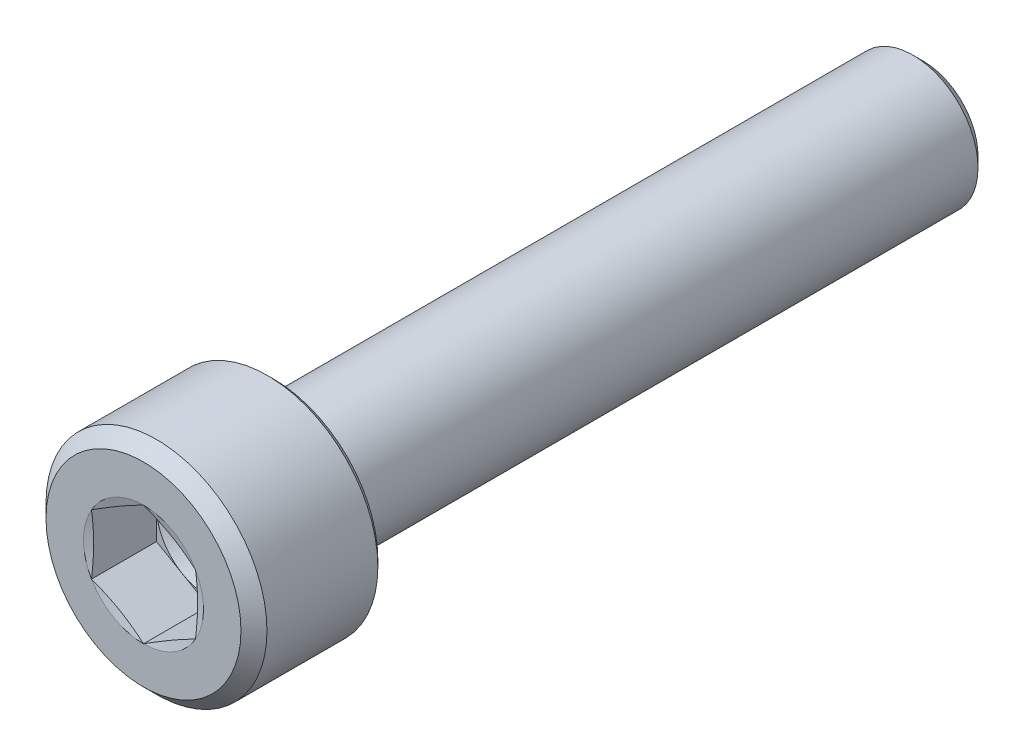
ISO-10303-21;
HEADER;
FILE_DESCRIPTION(('STEP AP214'),'2;1');
FILE_NAME('part.step','',(''),(''),'','','');
FILE_SCHEMA(('AUTOMOTIVE_DESIGN { 1 0 10303 214 1 1 1 1 }'));
ENDSEC;
DATA;
#1=APPLICATION_CONTEXT('core data for automotive mechanical design processes');
#2=APPLICATION_PROTOCOL_DEFINITION('international standard','automotive_design',2000,#1);
#3=PRODUCT_CONTEXT('',#1,'mechanical');
#4=PRODUCT('Part','Part','',(#3));
#5=PRODUCT_RELATED_PRODUCT_CATEGORY('part','',(#4));
#6=PRODUCT_DEFINITION_FORMATION('','',#4);
#7=PRODUCT_DEFINITION_CONTEXT('part definition',#1,'design');
#8=PRODUCT_DEFINITION('design','',#6,#7);
#9=PRODUCT_DEFINITION_SHAPE('','',#8);
#10=(LENGTH_UNIT() NAMED_UNIT(*) SI_UNIT(.MILLI.,.METRE.));
#11=(NAMED_UNIT(*) PLANE_ANGLE_UNIT() SI_UNIT($,.RADIAN.));
#12=(NAMED_UNIT(*) SI_UNIT($,.STERADIAN.) SOLID_ANGLE_UNIT());
#13=UNCERTAINTY_MEASURE_WITH_UNIT(LENGTH_MEASURE(1.E-05),#10,'distance_accuracy_value','');
#14=(GEOMETRIC_REPRESENTATION_CONTEXT(3) GLOBAL_UNCERTAINTY_ASSIGNED_CONTEXT((#13)) GLOBAL_UNIT_ASSIGNED_CONTEXT((#10,
#11,#12)) REPRESENTATION_CONTEXT('',''));
#15=CARTESIAN_POINT('',(0.,0.,0.));
#16=DIRECTION('',(0.,0.,1.));
#17=DIRECTION('',(1.,0.,0.));
#18=AXIS2_PLACEMENT_3D('',#15,#16,#17);
#19=CARTESIAN_POINT('',(2.,1.15470053837925,-2.5));
#20=DIRECTION('',(0.5,0.866025403784439,0.));
#21=DIRECTION('',(0.,0.,-1.));
#22=AXIS2_PLACEMENT_3D('',#19,#20,#21);
#23=PLANE('',#22);
#24=CARTESIAN_POINT('',(0.,2.3094010767585,0.));
#25=CARTESIAN_POINT('',(0.0425633823119709,2.28482382570566,-0.00658527078297476));
#26=CARTESIAN_POINT('',(0.0851609621981744,2.26022123386399,-0.0128624617924369));
#27=CARTESIAN_POINT('',(0.169590719267182,2.21146278990734,-0.0246149197548439));
#28=CARTESIAN_POINT('',(0.211421466351945,2.18730767178011,-0.0301035344043213));
#29=CARTESIAN_POINT('',(0.294534709698704,2.13933338683679,-0.040280933909989));
#30=CARTESIAN_POINT('',(0.335816093292774,2.11551457414403,-0.0449804129267517));
#31=CARTESIAN_POINT('',(0.418067328723173,2.06807245954831,-0.0535800869691));
#32=CARTESIAN_POINT('',(0.459036573992681,2.04444936338046,-0.0574872034397301));
#33=CARTESIAN_POINT('',(0.542105942407446,1.9964713268923,-0.0646202919637414));
#34=CARTESIAN_POINT('',(0.584206512798949,1.97211395870297,-0.0678248446642616));
#35=CARTESIAN_POINT('',(0.667845331882696,1.92372969130639,-0.0733062525415356));
#36=CARTESIAN_POINT('',(0.709382918692335,1.89970310083371,-0.0755958396504206));
#37=CARTESIAN_POINT('',(0.792314561065246,1.85180334473725,-0.0792518110133403));
#38=CARTESIAN_POINT('',(0.833708317497489,1.82793000580705,-0.0806226814230358));
#39=CARTESIAN_POINT('',(0.916742308626357,1.78006798987556,-0.0824510114905856));
#40=CARTESIAN_POINT('',(0.958382685265035,1.75607937336024,-0.0829035836538504));
#41=CARTESIAN_POINT('',(1.04160656499749,1.70802844834745,-0.0829039536078804));
#42=CARTESIAN_POINT('',(1.08319008000349,1.68396616048509,-0.0824519850713464));
#43=CARTESIAN_POINT('',(1.16614232267812,1.6359959725784,-0.0806244508305484));
#44=CARTESIAN_POINT('',(1.20751106141079,1.6120879122194,-0.0792536194503931));
#45=CARTESIAN_POINT('',(1.29046039872099,1.56421931101609,-0.075597576905792));
#46=CARTESIAN_POINT('',(1.33204099774182,1.54025912804585,-0.0733077208074989));
#47=CARTESIAN_POINT('',(1.4157769716645,1.49200969870299,-0.0678257908964699));
#48=CARTESIAN_POINT('',(1.45793172268238,1.46772084361545,-0.0646208369566601));
#49=CARTESIAN_POINT('',(1.54102078903926,1.4197637523774,-0.0574880406163537));
#50=CARTESIAN_POINT('',(1.58195747255381,1.39609636968376,-0.053581927053499));
#51=CARTESIAN_POINT('',(1.6641612654645,1.34858874355377,-0.0449835352058574));
#52=CARTESIAN_POINT('',(1.70542789927246,1.32474894442612,-0.0402842703166062));
#53=CARTESIAN_POINT('',(1.78853179531606,1.27675920888577,-0.0301068254493336));
#54=CARTESIAN_POINT('',(1.83036819240582,1.25261006903423,-0.0246178875385511));
#55=CARTESIAN_POINT('',(1.91481706725898,1.20386805540337,-0.0128642509205647));
#56=CARTESIAN_POINT('',(1.95742818508913,1.1792760521365,-0.00658614229819594));
#57=CARTESIAN_POINT('',(2.,1.15470053837925,0.));
#58=B_SPLINE_CURVE_WITH_KNOTS('',3,(#24,#25,#26,#27,#28,#29,#30,#31,#32,#33,#34,#35,#36,#37,#38,
#39,#40,#41,#42,#43,#44,#45,#46,#47,#48,#49,#50,#51,#52,#53,#54,#55,#56,#57),.UNSPECIFIED.,.F.,
.F.,(4,2,2,2,2,2,2,2,2,2,2,2,2,2,2,2,4),(0.,0.148766874535286,0.294606820686169,
0.438274846282944,0.580628017656161,0.726853447545081,0.87096665161791,1.01437091148585,
1.15853643630558,1.30266472322194,1.44605605797195,1.59018143609231,1.73644485761236,
1.87877967487471,2.02244082191178,2.16828655385211,2.31707290991441),.UNSPECIFIED.);
#59=CARTESIAN_POINT('',(0.,2.30940107675851,0.));
#60=VERTEX_POINT('',#59);
#61=CARTESIAN_POINT('',(2.,1.15470053837925,0.));
#62=VERTEX_POINT('',#61);
#63=EDGE_CURVE('E157',#60,#62,#58,.T.);
#64=ORIENTED_EDGE('',*,*,#63,.F.);
#65=DIRECTION('',(0.,0.,1.));
#66=VECTOR('',#65,1.);
#67=CARTESIAN_POINT('',(0.,2.30940107675851,-2.5));
#68=LINE('',#67,#66);
#69=CARTESIAN_POINT('',(0.,2.30940107675851,-2.5));
#70=VERTEX_POINT('',#69);
#71=EDGE_CURVE('E332',#70,#60,#68,.T.);
#72=ORIENTED_EDGE('',*,*,#71,.F.);
#73=DIRECTION('',(-0.866025403784439,0.5,0.));
#74=VECTOR('',#73,1.);
#75=CARTESIAN_POINT('',(2.,1.15470053837925,-2.5));
#76=LINE('',#75,#74);
#77=CARTESIAN_POINT('',(1.,1.73205080756888,-2.5));
#78=VERTEX_POINT('',#77);
#79=EDGE_CURVE('E380',#78,#70,#76,.T.);
#80=ORIENTED_EDGE('',*,*,#79,.F.);
#81=DIRECTION('',(-0.866025403784439,0.5,0.));
#82=VECTOR('',#81,1.);
#83=CARTESIAN_POINT('',(2.,1.15470053837925,-2.5));
#84=LINE('',#83,#82);
#85=CARTESIAN_POINT('',(2.,1.15470053837925,-2.5));
#86=VERTEX_POINT('',#85);
#87=EDGE_CURVE('E161',#86,#78,#84,.T.);
#88=ORIENTED_EDGE('',*,*,#87,.F.);
#89=DIRECTION('',(0.,0.,1.));
#90=VECTOR('',#89,1.);
#91=CARTESIAN_POINT('',(2.,1.15470053837925,-2.5));
#92=LINE('',#91,#90);
#93=EDGE_CURVE('E10',#86,#62,#92,.T.);
#94=ORIENTED_EDGE('',*,*,#93,.T.);
#95=EDGE_LOOP('',(#64,#72,#80,#88,#94));
#96=FACE_BOUND('',#95,.T.);
#97=ADVANCED_FACE('F16',(#96),#23,.F.);
#98=CARTESIAN_POINT('',(2.,-1.15470053837925,-2.5));
#99=DIRECTION('',(1.,0.,0.));
#100=DIRECTION('',(0.,1.,0.));
#101=AXIS2_PLACEMENT_3D('',#98,#99,#100);
#102=PLANE('',#101);
#103=CARTESIAN_POINT('',(2.,1.15470053837925,0.));
#104=CARTESIAN_POINT('',(1.9999971758146,1.10559938016855,-0.00657877825937162));
#105=CARTESIAN_POINT('',(1.99998944699676,1.05645602304888,-0.0128501009115137));
#106=CARTESIAN_POINT('',(1.99997806658765,0.959054194252896,-0.0245924298625357));
#107=CARTESIAN_POINT('',(1.99997433781248,0.910797323995098,-0.0300767483155109));
#108=CARTESIAN_POINT('',(1.99998359751542,0.81492579320712,-0.0402471560748688));
#109=CARTESIAN_POINT('',(1.9999963378607,0.767312271204178,-0.0449439165892805));
#110=CARTESIAN_POINT('',(2.00003546653749,0.672453111011467,-0.0535397458043652));
#111=CARTESIAN_POINT('',(2.00006172870545,0.625208100919636,-0.0574457313280469));
#112=CARTESIAN_POINT('',(2.00004611837403,0.529274763219141,-0.0645855968989982));
#113=CARTESIAN_POINT('',(2.00000222670508,0.480584711064261,-0.0677964274113592));
#114=CARTESIAN_POINT('',(1.99991841748751,0.383860331701837,-0.0732888727540297));
#115=CARTESIAN_POINT('',(1.99987845152948,0.335826737171599,-0.0755832901194108));
#116=CARTESIAN_POINT('',(1.99986366588704,0.239962717981797,-0.0792453120947795));
#117=CARTESIAN_POINT('',(1.9998885239626,0.192132467715618,-0.0806174586142727));
#118=CARTESIAN_POINT('',(1.99994941208485,0.0962015340396727,-0.08245246044446));
#119=CARTESIAN_POINT('',(1.99998550051117,0.0481007579972217,-0.0829104692770044));
#120=CARTESIAN_POINT('',(2.,0.,-0.0829037686547589));
#121=B_SPLINE_CURVE_WITH_KNOTS('',3,(#103,#104,#105,#106,#107,#108,#109,#110,#111,#112,#113,
#114,#115,#116,#117,#118,#119,#120),.UNSPECIFIED.,.F.,.F.,(4,2,2,2,2,2,2,2,4),(0.,
0.148620259481538,0.294318135051254,0.437846221402298,0.580058773528502,0.726438720844375,
0.870695461275644,1.01423647053232,1.15853648999317),.UNSPECIFIED.);
#122=CARTESIAN_POINT('',(2.,0.,-0.082903768654759));
#123=VERTEX_POINT('',#122);
#124=EDGE_CURVE('E196',#62,#123,#121,.T.);
#125=ORIENTED_EDGE('',*,*,#124,.F.);
#126=ORIENTED_EDGE('',*,*,#93,.F.);
#127=DIRECTION('',(0.,1.,0.));
#128=VECTOR('',#127,1.);
#129=CARTESIAN_POINT('',(2.,-1.15470053837925,-2.5));
#130=LINE('',#129,#128);
#131=CARTESIAN_POINT('',(2.,0.,-2.5));
#132=VERTEX_POINT('',#131);
#133=EDGE_CURVE('E174',#132,#86,#130,.T.);
#134=ORIENTED_EDGE('',*,*,#133,.F.);
#135=DIRECTION('',(0.,1.,0.));
#136=VECTOR('',#135,1.);
#137=CARTESIAN_POINT('',(2.,-1.15470053837925,-2.5));
#138=LINE('',#137,#136);
#139=CARTESIAN_POINT('',(2.,-1.15470053837925,-2.5));
#140=VERTEX_POINT('',#139);
#141=EDGE_CURVE('E361',#140,#132,#138,.T.);
#142=ORIENTED_EDGE('',*,*,#141,.F.);
#143=DIRECTION('',(0.,0.,1.));
#144=VECTOR('',#143,1.);
#145=CARTESIAN_POINT('',(2.,-1.15470053837925,-2.5));
#146=LINE('',#145,#144);
#147=CARTESIAN_POINT('',(2.,-1.15470053837925,0.));
#148=VERTEX_POINT('',#147);
#149=EDGE_CURVE('E29',#140,#148,#146,.T.);
#150=ORIENTED_EDGE('',*,*,#149,.T.);
#151=CARTESIAN_POINT('',(2.,0.,-0.0829037686547589));
#152=CARTESIAN_POINT('',(1.99998555981411,-0.0480626337482096,-0.0829104454697722));
#153=CARTESIAN_POINT('',(1.99995090495526,-0.0961252790550645,-0.0824527966371758));
#154=CARTESIAN_POINT('',(1.99989390848693,-0.191988216165346,-0.0806195306727037));
#155=CARTESIAN_POINT('',(1.9998715050684,-0.23978859752026,-0.0792486003594746));
#156=CARTESIAN_POINT('',(1.99989058893969,-0.335600482143639,-0.0755899847635507));
#157=CARTESIAN_POINT('',(1.99993240569122,-0.383611805647936,-0.0732976169410381));
#158=CARTESIAN_POINT('',(2.00001693407639,-0.480298664501986,-0.0678104164072034));
#159=CARTESIAN_POINT('',(2.00005964977091,-0.528973461379009,-0.0646026718115913));
#160=CARTESIAN_POINT('',(2.00007157520278,-0.624916052866736,-0.0574667105464565));
#161=CARTESIAN_POINT('',(2.00004278566152,-0.67218552115141,-0.0535608791712345));
#162=CARTESIAN_POINT('',(2.00000007634783,-0.767094417138231,-0.0449640408208166));
#163=CARTESIAN_POINT('',(1.99998629681263,-0.814733214974058,-0.040266094585913));
#164=CARTESIAN_POINT('',(1.99997547969609,-0.910656840517129,-0.0300922148547882));
#165=CARTESIAN_POINT('',(1.99997869881092,-0.958940526378031,-0.0246055771048901));
#166=CARTESIAN_POINT('',(1.99998947348254,-1.05639814339213,-0.0128574794542081));
#167=CARTESIAN_POINT('',(1.99999711487367,-1.10557046827418,-0.00658266592061943));
#168=CARTESIAN_POINT('',(2.,-1.15470053837925,0.));
#169=B_SPLINE_CURVE_WITH_KNOTS('',3,(#151,#152,#153,#154,#155,#156,#157,#158,#159,#160,#161,
#162,#163,#164,#165,#166,#167,#168),.UNSPECIFIED.,.F.,.F.,(4,2,2,2,2,2,2,2,4),(0.,
0.144185638963415,0.287636981833131,0.431826719642445,0.578160405495087,0.720446033944631,
0.864049915829581,1.00982849989602,1.15853627726478),.UNSPECIFIED.);
#170=EDGE_CURVE('E198',#123,#148,#169,.T.);
#171=ORIENTED_EDGE('',*,*,#170,.F.);
#172=EDGE_LOOP('',(#125,#126,#134,#142,#150,#171));
#173=FACE_BOUND('',#172,.T.);
#174=ADVANCED_FACE('F203',(#173),#102,.F.);
#175=CARTESIAN_POINT('',(0.,-2.3094010767585,-2.5));
#176=DIRECTION('',(0.5,-0.866025403784439,0.));
#177=DIRECTION('',(0.,0.,-1.));
#178=AXIS2_PLACEMENT_3D('',#175,#176,#177);
#179=PLANE('',#178);
#180=CARTESIAN_POINT('',(2.,-1.15470053837925,0.));
#181=CARTESIAN_POINT('',(1.95743378507766,-1.17927288320565,-0.0065852707828837));
#182=CARTESIAN_POINT('',(1.91482852560134,-1.20386217360572,-0.0128624617922492));
#183=CARTESIAN_POINT('',(1.83038759595222,-1.2526012660842,-0.0246149197545318));
#184=CARTESIAN_POINT('',(1.78855327648046,-1.27675019665525,-0.030103534403975));
#185=CARTESIAN_POINT('',(1.7054497053178,-1.32474123431294,-0.0402809339096389));
#186=CARTESIAN_POINT('',(1.66418131664067,-1.34858255486255,-0.0449804129264252));
#187=CARTESIAN_POINT('',(1.58196962247549,-1.39609315694039,-0.0535800869689056));
#188=CARTESIAN_POINT('',(1.5410267984427,-1.4197620160339,-0.0574872034396377));
#189=CARTESIAN_POINT('',(1.45794191581271,-1.46771318111302,-0.0646202919637392));
#190=CARTESIAN_POINT('',(1.41579753099615,-1.49199466049072,-0.0678248446642694));
#191=CARTESIAN_POINT('',(1.33207611674604,-1.54023586886093,-0.0733062525415533));
#192=CARTESIAN_POINT('',(1.29049968562577,-1.56419517901357,-0.075595839650431));
#193=CARTESIAN_POINT('',(1.20755145882476,-1.61206621003797,-0.079251811013348));
#194=CARTESIAN_POINT('',(1.16617966262179,-1.63597758520144,-0.0806226814230399));
#195=CARTESIAN_POINT('',(1.08321294538366,-1.68395612293148,-0.0824510114905914));
#196=CARTESIAN_POINT('',(1.04161800575987,-1.70802343866645,-0.0829035836538532));
#197=CARTESIAN_POINT('',(0.958392744156322,-1.7560719702104,-0.0829039536078792));
#198=CARTESIAN_POINT('',(0.916762434090979,-1.78005320665323,-0.0824519850713494));
#199=CARTESIAN_POINT('',(0.833742911401647,-1.82790686215718,-0.080624450830552));
#200=CARTESIAN_POINT('',(0.792353554409066,-1.85177921064272,-0.0792536194503983));
#201=CARTESIAN_POINT('',(0.709423461068239,-1.89968114337871,-0.0755975769057984));
#202=CARTESIAN_POINT('',(0.667883034426375,-1.92371090695011,-0.0733077208075098));
#203=CARTESIAN_POINT('',(0.584229815936511,-1.97210367290616,-0.067825790896475));
#204=CARTESIAN_POINT('',(0.542117674893325,-1.99646633063398,-0.0646208369566592));
#205=CARTESIAN_POINT('',(0.459041082411246,-2.04444502725692,-0.0574880406162984));
#206=CARTESIAN_POINT('',(0.418076185999905,-2.06806354378067,-0.0535819270533825));
#207=CARTESIAN_POINT('',(0.335831478442079,-2.1155003036641,-0.0449835352056614));
#208=CARTESIAN_POINT('',(0.294552289872298,-2.13931835730668,-0.0402842703163962));
#209=CARTESIAN_POINT('',(0.211440011751603,-2.18729357466367,-0.0301068254491258));
#210=CARTESIAN_POINT('',(0.169608044615814,-2.21145038742034,-0.0246178875383639));
#211=CARTESIAN_POINT('',(0.0851717851537173,-2.26021425154841,-0.012864250920452));
#212=CARTESIAN_POINT('',(0.0425689266799132,-2.2848205604393,-0.00658614229814123));
#213=CARTESIAN_POINT('',(0.,-2.3094010767585,0.));
#214=B_SPLINE_CURVE_WITH_KNOTS('',3,(#180,#181,#182,#183,#184,#185,#186,#187,#188,#189,#190,
#191,#192,#193,#194,#195,#196,#197,#198,#199,#200,#201,#202,#203,#204,#205,#206,#207,#208,#209,
#210,#211,#212,#213),.UNSPECIFIED.,.F.,.F.,(4,2,2,2,2,2,2,2,2,2,2,2,2,2,2,2,4),(0.,
0.148766874533244,0.294606820683524,0.438274846281021,0.58062801765617,0.726853447543114,
0.870966651615286,1.01437091148389,1.15853643630559,1.30266472322314,1.44605605797354,
1.5901814360935,1.73644485761236,1.87877967487588,2.02244082191339,2.16828655385335,
2.31707290991442),.UNSPECIFIED.);
#215=CARTESIAN_POINT('',(0.,-2.30940107675851,0.));
#216=VERTEX_POINT('',#215);
#217=EDGE_CURVE('E175',#148,#216,#214,.T.);
#218=ORIENTED_EDGE('',*,*,#217,.F.);
#219=ORIENTED_EDGE('',*,*,#149,.F.);
#220=DIRECTION('',(0.866025403784439,0.5,0.));
#221=VECTOR('',#220,1.);
#222=CARTESIAN_POINT('',(0.,-2.3094010767585,-2.5));
#223=LINE('',#222,#221);
#224=CARTESIAN_POINT('',(1.,-1.73205080756887,-2.5));
#225=VERTEX_POINT('',#224);
#226=EDGE_CURVE('E365',#225,#140,#223,.T.);
#227=ORIENTED_EDGE('',*,*,#226,.F.);
#228=DIRECTION('',(0.866025403784439,0.5,0.));
#229=VECTOR('',#228,1.);
#230=CARTESIAN_POINT('',(0.,-2.3094010767585,-2.5));
#231=LINE('',#230,#229);
#232=CARTESIAN_POINT('',(0.,-2.3094010767585,-2.5));
#233=VERTEX_POINT('',#232);
#234=EDGE_CURVE('E384',#233,#225,#231,.T.);
#235=ORIENTED_EDGE('',*,*,#234,.F.);
#236=DIRECTION('',(0.,0.,1.));
#237=VECTOR('',#236,1.);
#238=CARTESIAN_POINT('',(0.,-2.3094010767585,-2.5));
#239=LINE('',#238,#237);
#240=EDGE_CURVE('E512',#233,#216,#239,.T.);
#241=ORIENTED_EDGE('',*,*,#240,.T.);
#242=EDGE_LOOP('',(#218,#219,#227,#235,#241));
#243=FACE_BOUND('',#242,.T.);
#244=ADVANCED_FACE('F248',(#243),#179,.F.);
#245=CARTESIAN_POINT('',(-2.,-1.15470053837925,-2.5));
#246=DIRECTION('',(-0.5,-0.866025403784439,0.));
#247=DIRECTION('',(-0.866025403784439,0.5,0.));
#248=AXIS2_PLACEMENT_3D('',#245,#246,#247);
#249=PLANE('',#248);
#250=CARTESIAN_POINT('',(0.,-2.3094010767585,0.));
#251=CARTESIAN_POINT('',(-0.0425633823124517,-2.28482382570538,-0.00658527078305046));
#252=CARTESIAN_POINT('',(-0.0851609621991149,-2.26022123386338,-0.0128624617925928));
#253=CARTESIAN_POINT('',(-0.169590719268688,-2.21146278990626,-0.024614919755103));
#254=CARTESIAN_POINT('',(-0.211421466353557,-2.18730767177888,-0.0301035344046088));
#255=CARTESIAN_POINT('',(-0.294534709700233,-2.13933338683548,-0.04028093391028));
#256=CARTESIAN_POINT('',(-0.335816093294115,-2.11551457414279,-0.0449804129270233));
#257=CARTESIAN_POINT('',(-0.418067328723942,-2.06807245954753,-0.0535800869692619));
#258=CARTESIAN_POINT('',(-0.459036573993066,-2.04444936338007,-0.0574872034398075));
#259=CARTESIAN_POINT('',(-0.542105942407995,-1.99647132689215,-0.0646202919637441));
#260=CARTESIAN_POINT('',(-0.584206512800049,-1.97211395870268,-0.0678248446642561));
#261=CARTESIAN_POINT('',(-0.667845331884484,-1.92372969130583,-0.0733062525415221));
#262=CARTESIAN_POINT('',(-0.709382918694263,-1.89970310083303,-0.0755958396504133));
#263=CARTESIAN_POINT('',(-0.792314561067119,-1.85180334473646,-0.0792518110133352));
#264=CARTESIAN_POINT('',(-0.833708317499165,-1.82793000580629,-0.0806226814230336));
#265=CARTESIAN_POINT('',(-0.916742308627337,-1.78006798987506,-0.0824510114905825));
#266=CARTESIAN_POINT('',(-0.958382685265516,-1.75607937335996,-0.0829035836538506));
#267=CARTESIAN_POINT('',(-1.04160656499709,-1.70802844834768,-0.0829039536078818));
#268=CARTESIAN_POINT('',(-1.08319008000271,-1.68396616048559,-0.0824519850713441));
#269=CARTESIAN_POINT('',(-1.16614232267685,-1.6359959725793,-0.0806244508305463));
#270=CARTESIAN_POINT('',(-1.20751106140942,-1.61208791222044,-0.0792536194503888));
#271=CARTESIAN_POINT('',(-1.29046039871966,-1.56421931101721,-0.0755975769057861));
#272=CARTESIAN_POINT('',(-1.33204099774065,-1.54025912804693,-0.0733077208074876));
#273=CARTESIAN_POINT('',(-1.41577697166382,-1.49200969870367,-0.0678257908964654));
#274=CARTESIAN_POINT('',(-1.45793172268204,-1.4677208436158,-0.0646208369566626));
#275=CARTESIAN_POINT('',(-1.5410207890388,-1.41976375237752,-0.0574880406164197));
#276=CARTESIAN_POINT('',(-1.58195747255291,-1.39609636968399,-0.0535819270536368));
#277=CARTESIAN_POINT('',(-1.66416126546302,-1.34858874355423,-0.0449835352060884));
#278=CARTESIAN_POINT('',(-1.70542789927084,-1.32474894442669,-0.0402842703168537));
#279=CARTESIAN_POINT('',(-1.78853179531446,-1.27675920888644,-0.0301068254495781));
#280=CARTESIAN_POINT('',(-1.83036819240438,-1.25261006903488,-0.0246178875387715));
#281=CARTESIAN_POINT('',(-1.91481706725812,-1.20386805540381,-0.0128642509206973));
#282=CARTESIAN_POINT('',(-1.95742818508871,-1.17927605213674,-0.00658614229826027));
#283=CARTESIAN_POINT('',(-2.,-1.15470053837926,0.));
#284=B_SPLINE_CURVE_WITH_KNOTS('',3,(#250,#251,#252,#253,#254,#255,#256,#257,#258,#259,#260,
#261,#262,#263,#264,#265,#266,#267,#268,#269,#270,#271,#272,#273,#274,#275,#276,#277,#278,#279,
#280,#281,#282,#283),.UNSPECIFIED.,.F.,.F.,(4,2,2,2,2,2,2,2,2,2,2,2,2,2,2,2,4),(0.,
0.148766874536984,0.294606820688371,0.438274846284549,0.580628017656168,0.726853447546727,
0.870966651620108,1.01437091148751,1.15853643630558,1.30266472322055,1.44605605797009,
1.59018143609091,1.73644485761235,1.87877967487335,2.02244082190991,2.16828655385066,
2.3170729099144),.UNSPECIFIED.);
#285=CARTESIAN_POINT('',(-2.,-1.15470053837925,0.));
#286=VERTEX_POINT('',#285);
#287=EDGE_CURVE('E478',#216,#286,#284,.T.);
#288=ORIENTED_EDGE('',*,*,#287,.F.);
#289=ORIENTED_EDGE('',*,*,#240,.F.);
#290=DIRECTION('',(0.866025403784439,-0.5,0.));
#291=VECTOR('',#290,1.);
#292=CARTESIAN_POINT('',(-2.,-1.15470053837925,-2.5));
#293=LINE('',#292,#291);
#294=CARTESIAN_POINT('',(-1.,-1.73205080756887,-2.5));
#295=VERTEX_POINT('',#294);
#296=EDGE_CURVE('E364',#295,#233,#293,.T.);
#297=ORIENTED_EDGE('',*,*,#296,.F.);
#298=DIRECTION('',(0.866025403784439,-0.5,0.));
#299=VECTOR('',#298,1.);
#300=CARTESIAN_POINT('',(-2.,-1.15470053837925,-2.5));
#301=LINE('',#300,#299);
#302=CARTESIAN_POINT('',(-2.,-1.15470053837925,-2.5));
#303=VERTEX_POINT('',#302);
#304=EDGE_CURVE('E394',#303,#295,#301,.T.);
#305=ORIENTED_EDGE('',*,*,#304,.F.);
#306=DIRECTION('',(0.,0.,1.));
#307=VECTOR('',#306,1.);
#308=CARTESIAN_POINT('',(-2.,-1.15470053837925,-2.5));
#309=LINE('',#308,#307);
#310=EDGE_CURVE('E341',#303,#286,#309,.T.);
#311=ORIENTED_EDGE('',*,*,#310,.T.);
#312=EDGE_LOOP('',(#288,#289,#297,#305,#311));
#313=FACE_BOUND('',#312,.T.);
#314=ADVANCED_FACE('F316',(#313),#249,.F.);
#315=CARTESIAN_POINT('',(-2.,1.15470053837925,-2.5));
#316=DIRECTION('',(-1.,0.,0.));
#317=DIRECTION('',(0.,0.,1.));
#318=AXIS2_PLACEMENT_3D('',#315,#316,#317);
#319=PLANE('',#318);
#320=CARTESIAN_POINT('',(-2.,-1.15470053837926,0.));
#321=CARTESIAN_POINT('',(-1.99999713341261,-1.10548960119524,-0.00659349994683994));
#322=CARTESIAN_POINT('',(-1.99999001439798,-1.05623625144953,-0.0128780060927307));
#323=CARTESIAN_POINT('',(-1.99998060910477,-0.958615251215465,-0.0246431934130829));
#324=CARTESIAN_POINT('',(-1.99997823064012,-0.910249208018163,-0.0301372396865746));
#325=CARTESIAN_POINT('',(-1.99999041666403,-0.814158446504453,-0.0403236142290196));
#326=CARTESIAN_POINT('',(-2.00000473011996,-0.76643486816009,-0.0450266347192323));
#327=CARTESIAN_POINT('',(-2.00004652000518,-0.671352739896966,-0.0536314900251229));
#328=CARTESIAN_POINT('',(-2.00007387560003,-0.623994815190128,-0.0575402190336094));
#329=CARTESIAN_POINT('',(-2.00005845896974,-0.527888120565473,-0.0646777765433628));
#330=CARTESIAN_POINT('',(-2.00001369287065,-0.479137692036126,-0.0678843923543035));
#331=CARTESIAN_POINT('',(-1.99992846343813,-0.38229572529829,-0.0733654519077141));
#332=CARTESIAN_POINT('',(-1.99988794697284,-0.334204921765323,-0.0756527809453042));
#333=CARTESIAN_POINT('',(-1.99986859003052,-0.238227588755144,-0.0792997958800163));
#334=CARTESIAN_POINT('',(-1.99988944362067,-0.190341233728829,-0.0806640416301184));
#335=CARTESIAN_POINT('',(-1.99995548502895,-0.0942971448419419,-0.0824747486435702));
#336=CARTESIAN_POINT('',(-2.00000080135689,-0.0461393190190874,-0.0829163025262149));
#337=CARTESIAN_POINT('',(-1.99999920117611,0.0500238603427236,-0.0828907294700894));
#338=CARTESIAN_POINT('',(-1.9999525757529,0.0980292146733851,-0.0824264703640131));
#339=CARTESIAN_POINT('',(-1.99988530566595,0.193778523562446,-0.0805761348477542));
#340=CARTESIAN_POINT('',(-1.99986453033935,0.241522568216185,-0.079194749030331));
#341=CARTESIAN_POINT('',(-1.99988319873575,0.337220665629865,-0.0755193070115986));
#342=CARTESIAN_POINT('',(-1.99992295205882,0.385174538655754,-0.073220603238064));
#343=CARTESIAN_POINT('',(-2.00000494629768,0.481743325463302,-0.0677226422132793));
#344=CARTESIAN_POINT('',(-2.00004721534993,0.530357502799515,-0.0645105427039974));
#345=CARTESIAN_POINT('',(-2.00005964394824,0.62612676012278,-0.0573722164336154));
#346=CARTESIAN_POINT('',(-2.00003184313588,0.673283579034134,-0.0534691942966007));
#347=CARTESIAN_POINT('',(-1.99999170713457,0.767970011400858,-0.0448814384269832));
#348=CARTESIAN_POINT('',(-1.99997951884658,0.815498992151107,-0.0401897428011197));
#349=CARTESIAN_POINT('',(-1.99997163040192,0.911203850654714,-0.030031812894688));
#350=CARTESIAN_POINT('',(-1.9999761835141,0.959378588033395,-0.0245548958453313));
#351=CARTESIAN_POINT('',(-1.99998890540873,1.0566174773319,-0.0128296293417804));
#352=CARTESIAN_POINT('',(-1.99999714507433,1.10568002885256,-0.00656797916916223));
#353=CARTESIAN_POINT('',(-2.,1.15470053837925,0.));
#354=B_SPLINE_CURVE_WITH_KNOTS('',3,(#320,#321,#322,#323,#324,#325,#326,#327,#328,#329,#330,
#331,#332,#333,#334,#335,#336,#337,#338,#339,#340,#341,#342,#343,#344,#345,#346,#347,#348,#349,
#350,#351,#352,#353),.UNSPECIFIED.,.F.,.F.,(4,2,2,2,2,2,2,2,2,2,2,2,2,2,2,2,4),(0.,
0.148952547682911,0.294979106594678,0.438837566790982,0.581388350232403,0.72794815627218,
0.872375335412716,1.01608375931162,1.16055457798047,1.30456873960764,1.44785196522356,
1.59187054107806,1.73802363231839,1.87997181997091,2.02324604190021,2.16869661516907,
2.3170727653732),.UNSPECIFIED.);
#355=CARTESIAN_POINT('',(-2.,1.15470053837925,0.));
#356=VERTEX_POINT('',#355);
#357=EDGE_CURVE('E506',#286,#356,#354,.T.);
#358=ORIENTED_EDGE('',*,*,#357,.F.);
#359=ORIENTED_EDGE('',*,*,#310,.F.);
#360=DIRECTION('',(0.,-1.,0.));
#361=VECTOR('',#360,1.);
#362=CARTESIAN_POINT('',(-2.,1.15470053837925,-2.5));
#363=LINE('',#362,#361);
#364=CARTESIAN_POINT('',(-2.,0.,-2.5));
#365=VERTEX_POINT('',#364);
#366=EDGE_CURVE('E390',#365,#303,#363,.T.);
#367=ORIENTED_EDGE('',*,*,#366,.F.);
#368=DIRECTION('',(0.,-1.,0.));
#369=VECTOR('',#368,1.);
#370=CARTESIAN_POINT('',(-2.,1.15470053837925,-2.5));
#371=LINE('',#370,#369);
#372=CARTESIAN_POINT('',(-2.,1.15470053837925,-2.5));
#373=VERTEX_POINT('',#372);
#374=EDGE_CURVE('E333',#373,#365,#371,.T.);
#375=ORIENTED_EDGE('',*,*,#374,.F.);
#376=DIRECTION('',(0.,0.,1.));
#377=VECTOR('',#376,1.);
#378=CARTESIAN_POINT('',(-2.,1.15470053837925,-2.5));
#379=LINE('',#378,#377);
#380=EDGE_CURVE('E44',#373,#356,#379,.T.);
#381=ORIENTED_EDGE('',*,*,#380,.T.);
#382=EDGE_LOOP('',(#358,#359,#367,#375,#381));
#383=FACE_BOUND('',#382,.T.);
#384=ADVANCED_FACE('F271',(#383),#319,.F.);
#385=CARTESIAN_POINT('',(0.,2.30940107675851,-2.5));
#386=DIRECTION('',(-0.5,0.866025403784439,0.));
#387=DIRECTION('',(0.,0.,1.));
#388=AXIS2_PLACEMENT_3D('',#385,#386,#387);
#389=PLANE('',#388);
#390=CARTESIAN_POINT('',(-2.,1.15470053837925,0.));
#391=CARTESIAN_POINT('',(-1.95743378507658,1.17927288320626,-0.00658527078305043));
#392=CARTESIAN_POINT('',(-1.91482852559914,1.20386217360685,-0.0128624617925928));
#393=CARTESIAN_POINT('',(-1.83038759594849,1.25260126608589,-0.0246149197551029));
#394=CARTESIAN_POINT('',(-1.78855327647633,1.27675019665698,-0.0301035344046087));
#395=CARTESIAN_POINT('',(-1.70544970531361,1.32474123431442,-0.0402809339102798));
#396=CARTESIAN_POINT('',(-1.66418131663682,1.34858255486375,-0.0449804129270231));
#397=CARTESIAN_POINT('',(-1.58196962247316,1.396093156941,-0.0535800869692616));
#398=CARTESIAN_POINT('',(-1.54102679844153,1.4197620160342,-0.0574872034398072));
#399=CARTESIAN_POINT('',(-1.45794191581183,1.4677131811139,-0.0646202919637438));
#400=CARTESIAN_POINT('',(-1.41579753099439,1.4919946604925,-0.0678248446642558));
#401=CARTESIAN_POINT('',(-1.332076116743,1.54023586886373,-0.0733062525415215));
#402=CARTESIAN_POINT('',(-1.29049968562234,1.5641951790165,-0.0755958396504125));
#403=CARTESIAN_POINT('',(-1.20755145882121,1.61206621004067,-0.0792518110133349));
#404=CARTESIAN_POINT('',(-1.1661796626185,1.6359775852038,-0.0806226814230341));
#405=CARTESIAN_POINT('',(-1.08321294538163,1.6839561229328,-0.0824510114905808));
#406=CARTESIAN_POINT('',(-1.04161800575884,1.70802343866708,-0.082903583653846));
#407=CARTESIAN_POINT('',(-0.958392744156581,1.75607197021023,-0.0829039536078852));
#408=CARTESIAN_POINT('',(-0.916762434091534,1.78005320665294,-0.0824519850713484));
#409=CARTESIAN_POINT('',(-0.833742911402609,1.82790686215676,-0.0806244508305478));
#410=CARTESIAN_POINT('',(-0.792353554410137,1.85177921064227,-0.0792536194503939));
#411=CARTESIAN_POINT('',(-0.709423461069339,1.89968114337832,-0.0755975769057937));
#412=CARTESIAN_POINT('',(-0.667883034427395,1.9237109069498,-0.0733077208075013));
#413=CARTESIAN_POINT('',(-0.584229815937133,1.972103672906,-0.0678257908964709));
#414=CARTESIAN_POINT('',(-0.54211767489363,1.9964663306339,-0.06462083695666));
#415=CARTESIAN_POINT('',(-0.459041082411455,2.0444450272567,-0.0574880406163423));
#416=CARTESIAN_POINT('',(-0.418076186000337,2.06806354378022,-0.0535819270534749));
#417=CARTESIAN_POINT('',(-0.335831478442842,2.11550030366339,-0.0449835352058167));
#418=CARTESIAN_POINT('',(-0.294552289873171,2.13931835730593,-0.0402842703165626));
#419=CARTESIAN_POINT('',(-0.211440011752526,2.18729357466297,-0.0301068254492905));
#420=CARTESIAN_POINT('',(-0.169608044616676,2.21145038741972,-0.0246178875385123));
#421=CARTESIAN_POINT('',(-0.0851717851542553,2.26021425154807,-0.0128642509205413));
#422=CARTESIAN_POINT('',(-0.0425689266801875,2.28482056043914,-0.00658614229818459));
#423=CARTESIAN_POINT('',(0.,2.3094010767585,0.));
#424=B_SPLINE_CURVE_WITH_KNOTS('',3,(#390,#391,#392,#393,#394,#395,#396,#397,#398,#399,#400,
#401,#402,#403,#404,#405,#406,#407,#408,#409,#410,#411,#412,#413,#414,#415,#416,#417,#418,#419,
#420,#421,#422,#423),.UNSPECIFIED.,.F.,.F.,(4,2,2,2,2,2,2,2,2,2,2,2,2,2,2,2,4),(0.,
0.148766874536988,0.294606820688377,0.438274846284552,0.580628017656167,0.726853447546728,
0.870966651620106,1.01437091148751,1.15853643630558,1.30266472322219,1.44605605797229,
1.59018143609256,1.73644485761237,1.87877967487496,2.02244082191212,2.16828655385237,
2.31707290991441),.UNSPECIFIED.);
#425=EDGE_CURVE('E281',#356,#60,#424,.T.);
#426=ORIENTED_EDGE('',*,*,#425,.F.);
#427=ORIENTED_EDGE('',*,*,#380,.F.);
#428=DIRECTION('',(-0.866025403784439,-0.5,0.));
#429=VECTOR('',#428,1.);
#430=CARTESIAN_POINT('',(0.,2.30940107675851,-2.5));
#431=LINE('',#430,#429);
#432=CARTESIAN_POINT('',(-1.,1.73205080756888,-2.5));
#433=VERTEX_POINT('',#432);
#434=EDGE_CURVE('E344',#433,#373,#431,.T.);
#435=ORIENTED_EDGE('',*,*,#434,.F.);
#436=DIRECTION('',(-0.866025403784439,-0.5,0.));
#437=VECTOR('',#436,1.);
#438=CARTESIAN_POINT('',(0.,2.30940107675851,-2.5));
#439=LINE('',#438,#437);
#440=EDGE_CURVE('E355',#70,#433,#439,.T.);
#441=ORIENTED_EDGE('',*,*,#440,.F.);
#442=ORIENTED_EDGE('',*,*,#71,.T.);
#443=EDGE_LOOP('',(#426,#427,#435,#441,#442));
#444=FACE_BOUND('',#443,.T.);
#445=ADVANCED_FACE('F267',(#444),#389,.F.);
#446=CARTESIAN_POINT('',(0.,0.,-2.5));
#447=DIRECTION('',(0.,0.,1.));
#448=DIRECTION('',(1.,0.,0.));
#449=AXIS2_PLACEMENT_3D('',#446,#447,#448);
#450=PLANE('',#449);
#451=CARTESIAN_POINT('',(0.,0.,-2.5));
#452=DIRECTION('',(0.,0.,1.));
#453=DIRECTION('',(1.,0.,0.));
#454=AXIS2_PLACEMENT_3D('',#451,#452,#453);
#455=CIRCLE('',#454,2.);
#456=EDGE_CURVE('E385',#433,#365,#455,.T.);
#457=ORIENTED_EDGE('',*,*,#456,.F.);
#458=ORIENTED_EDGE('',*,*,#434,.T.);
#459=ORIENTED_EDGE('',*,*,#374,.T.);
#460=EDGE_LOOP('',(#457,#458,#459));
#461=FACE_BOUND('',#460,.T.);
#462=ADVANCED_FACE('F270',(#461),#450,.T.);
#463=CARTESIAN_POINT('',(0.,0.,-2.5));
#464=DIRECTION('',(0.,0.,1.));
#465=DIRECTION('',(1.,0.,0.));
#466=AXIS2_PLACEMENT_3D('',#463,#464,#465);
#467=PLANE('',#466);
#468=CARTESIAN_POINT('',(0.,0.,-2.5));
#469=DIRECTION('',(0.,0.,1.));
#470=DIRECTION('',(1.,0.,0.));
#471=AXIS2_PLACEMENT_3D('',#468,#469,#470);
#472=CIRCLE('',#471,2.);
#473=EDGE_CURVE('E206',#78,#433,#472,.T.);
#474=ORIENTED_EDGE('',*,*,#473,.F.);
#475=ORIENTED_EDGE('',*,*,#79,.T.);
#476=ORIENTED_EDGE('',*,*,#440,.T.);
#477=EDGE_LOOP('',(#474,#475,#476));
#478=FACE_BOUND('',#477,.T.);
#479=ADVANCED_FACE('F301',(#478),#467,.T.);
#480=CARTESIAN_POINT('',(0.,0.,-2.5));
#481=DIRECTION('',(0.,0.,1.));
#482=DIRECTION('',(1.,0.,0.));
#483=AXIS2_PLACEMENT_3D('',#480,#481,#482);
#484=PLANE('',#483);
#485=CARTESIAN_POINT('',(0.,0.,-2.5));
#486=DIRECTION('',(0.,0.,1.));
#487=DIRECTION('',(1.,0.,0.));
#488=AXIS2_PLACEMENT_3D('',#485,#486,#487);
#489=CIRCLE('',#488,2.);
#490=EDGE_CURVE('E389',#365,#295,#489,.T.);
#491=ORIENTED_EDGE('',*,*,#490,.F.);
#492=ORIENTED_EDGE('',*,*,#366,.T.);
#493=ORIENTED_EDGE('',*,*,#304,.T.);
#494=EDGE_LOOP('',(#491,#492,#493));
#495=FACE_BOUND('',#494,.T.);
#496=ADVANCED_FACE('F304',(#495),#484,.T.);
#497=CARTESIAN_POINT('',(0.,0.,-2.5));
#498=DIRECTION('',(0.,0.,1.));
#499=DIRECTION('',(1.,0.,0.));
#500=AXIS2_PLACEMENT_3D('',#497,#498,#499);
#501=PLANE('',#500);
#502=CARTESIAN_POINT('',(0.,0.,-2.5));
#503=DIRECTION('',(0.,0.,1.));
#504=DIRECTION('',(1.,0.,0.));
#505=AXIS2_PLACEMENT_3D('',#502,#503,#504);
#506=CIRCLE('',#505,2.);
#507=EDGE_CURVE('E429',#295,#225,#506,.T.);
#508=ORIENTED_EDGE('',*,*,#507,.F.);
#509=ORIENTED_EDGE('',*,*,#296,.T.);
#510=ORIENTED_EDGE('',*,*,#234,.T.);
#511=EDGE_LOOP('',(#508,#509,#510));
#512=FACE_BOUND('',#511,.T.);
#513=ADVANCED_FACE('F225',(#512),#501,.T.);
#514=CARTESIAN_POINT('',(0.,0.,-2.5));
#515=DIRECTION('',(0.,0.,1.));
#516=DIRECTION('',(1.,0.,0.));
#517=AXIS2_PLACEMENT_3D('',#514,#515,#516);
#518=PLANE('',#517);
#519=CARTESIAN_POINT('',(0.,0.,-2.5));
#520=DIRECTION('',(0.,0.,1.));
#521=DIRECTION('',(1.,0.,0.));
#522=AXIS2_PLACEMENT_3D('',#519,#520,#521);
#523=CIRCLE('',#522,2.);
#524=EDGE_CURVE('E373',#225,#132,#523,.T.);
#525=ORIENTED_EDGE('',*,*,#524,.F.);
#526=ORIENTED_EDGE('',*,*,#226,.T.);
#527=ORIENTED_EDGE('',*,*,#141,.T.);
#528=EDGE_LOOP('',(#525,#526,#527));
#529=FACE_BOUND('',#528,.T.);
#530=ADVANCED_FACE('F262',(#529),#518,.T.);
#531=CARTESIAN_POINT('',(0.,0.,-2.5));
#532=DIRECTION('',(0.,0.,1.));
#533=DIRECTION('',(1.,0.,0.));
#534=AXIS2_PLACEMENT_3D('',#531,#532,#533);
#535=PLANE('',#534);
#536=CARTESIAN_POINT('',(0.,0.,-2.5));
#537=DIRECTION('',(0.,0.,1.));
#538=DIRECTION('',(1.,0.,0.));
#539=AXIS2_PLACEMENT_3D('',#536,#537,#538);
#540=CIRCLE('',#539,2.);
#541=EDGE_CURVE('E369',#132,#78,#540,.T.);
#542=ORIENTED_EDGE('',*,*,#541,.F.);
#543=ORIENTED_EDGE('',*,*,#133,.T.);
#544=ORIENTED_EDGE('',*,*,#87,.T.);
#545=EDGE_LOOP('',(#542,#543,#544));
#546=FACE_BOUND('',#545,.T.);
#547=ADVANCED_FACE('F265',(#546),#535,.T.);
#548=CARTESIAN_POINT('',(0.,0.,-0.0829037686547588));
#549=DIRECTION('',(0.,0.,1.));
#550=DIRECTION('',(1.,0.,0.));
#551=AXIS2_PLACEMENT_3D('',#548,#549,#550);
#552=CONICAL_SURFACE('',#551,2.,1.30899693899575);
#553=ORIENTED_EDGE('',*,*,#63,.T.);
#554=CARTESIAN_POINT('',(0.,0.,0.));
#555=DIRECTION('',(0.,0.,1.));
#556=DIRECTION('',(1.,0.,0.));
#557=AXIS2_PLACEMENT_3D('',#554,#555,#556);
#558=CIRCLE('',#557,2.30940107675851);
#559=EDGE_CURVE('E171',#62,#60,#558,.T.);
#560=ORIENTED_EDGE('',*,*,#559,.T.);
#561=EDGE_LOOP('',(#553,#560));
#562=FACE_BOUND('',#561,.T.);
#563=ADVANCED_FACE('F170',(#562),#552,.F.);
#564=CARTESIAN_POINT('',(0.,0.,-0.0829037686547588));
#565=DIRECTION('',(0.,0.,1.));
#566=DIRECTION('',(1.,0.,0.));
#567=AXIS2_PLACEMENT_3D('',#564,#565,#566);
#568=CONICAL_SURFACE('',#567,2.,1.30899693899575);
#569=ORIENTED_EDGE('',*,*,#217,.T.);
#570=CARTESIAN_POINT('',(0.,0.,0.));
#571=DIRECTION('',(0.,0.,1.));
#572=DIRECTION('',(1.,0.,0.));
#573=AXIS2_PLACEMENT_3D('',#570,#571,#572);
#574=CIRCLE('',#573,2.30940107675851);
#575=EDGE_CURVE('E191',#216,#148,#574,.T.);
#576=ORIENTED_EDGE('',*,*,#575,.T.);
#577=EDGE_LOOP('',(#569,#576));
#578=FACE_BOUND('',#577,.T.);
#579=ADVANCED_FACE('F249',(#578),#568,.F.);
#580=CARTESIAN_POINT('',(0.,0.,-0.0829037686547588));
#581=DIRECTION('',(0.,0.,1.));
#582=DIRECTION('',(1.,0.,0.));
#583=AXIS2_PLACEMENT_3D('',#580,#581,#582);
#584=CONICAL_SURFACE('',#583,2.,1.30899693899575);
#585=ORIENTED_EDGE('',*,*,#287,.T.);
#586=CARTESIAN_POINT('',(0.,0.,0.));
#587=DIRECTION('',(0.,0.,1.));
#588=DIRECTION('',(1.,0.,0.));
#589=AXIS2_PLACEMENT_3D('',#586,#587,#588);
#590=CIRCLE('',#589,2.30940107675851);
#591=EDGE_CURVE('E454',#286,#216,#590,.T.);
#592=ORIENTED_EDGE('',*,*,#591,.T.);
#593=EDGE_LOOP('',(#585,#592));
#594=FACE_BOUND('',#593,.T.);
#595=ADVANCED_FACE('F483',(#594),#584,.F.);
#596=CARTESIAN_POINT('',(0.,0.,-0.0829037686547588));
#597=DIRECTION('',(0.,0.,1.));
#598=DIRECTION('',(1.,0.,0.));
#599=AXIS2_PLACEMENT_3D('',#596,#597,#598);
#600=CONICAL_SURFACE('',#599,2.,1.30899693899575);
#601=ORIENTED_EDGE('',*,*,#357,.T.);
#602=CARTESIAN_POINT('',(0.,0.,0.));
#603=DIRECTION('',(0.,0.,1.));
#604=DIRECTION('',(1.,0.,0.));
#605=AXIS2_PLACEMENT_3D('',#602,#603,#604);
#606=CIRCLE('',#605,2.30940107675851);
#607=EDGE_CURVE('E460',#356,#286,#606,.T.);
#608=ORIENTED_EDGE('',*,*,#607,.T.);
#609=EDGE_LOOP('',(#601,#608));
#610=FACE_BOUND('',#609,.T.);
#611=ADVANCED_FACE('F297',(#610),#600,.F.);
#612=CARTESIAN_POINT('',(0.,0.,-0.0829037686547588));
#613=DIRECTION('',(0.,0.,1.));
#614=DIRECTION('',(1.,0.,0.));
#615=AXIS2_PLACEMENT_3D('',#612,#613,#614);
#616=CONICAL_SURFACE('',#615,2.,1.30899693899575);
#617=CARTESIAN_POINT('',(0.,0.,0.));
#618=DIRECTION('',(0.,0.,1.));
#619=DIRECTION('',(1.,0.,0.));
#620=AXIS2_PLACEMENT_3D('',#617,#618,#619);
#621=CIRCLE('',#620,2.30940107675851);
#622=EDGE_CURVE('E189',#60,#356,#621,.T.);
#623=ORIENTED_EDGE('',*,*,#622,.T.);
#624=ORIENTED_EDGE('',*,*,#425,.T.);
#625=EDGE_LOOP('',(#623,#624));
#626=FACE_BOUND('',#625,.T.);
#627=ADVANCED_FACE('F287',(#626),#616,.F.);
#628=CARTESIAN_POINT('',(0.,2.1,-30.));
#629=DIRECTION('',(0.,0.,1.));
#630=DIRECTION('',(1.,0.,0.));
#631=AXIS2_PLACEMENT_3D('',#628,#629,#630);
#632=PLANE('',#631);
#633=CARTESIAN_POINT('',(0.,0.,-30.));
#634=DIRECTION('',(0.,0.,1.));
#635=DIRECTION('',(1.,0.,0.));
#636=AXIS2_PLACEMENT_3D('',#633,#634,#635);
#637=CIRCLE('',#636,2.1);
#638=CARTESIAN_POINT('',(-2.1,0.,-30.));
#639=VERTEX_POINT('',#638);
#640=EDGE_CURVE('E201',#639,#639,#637,.T.);
#641=ORIENTED_EDGE('',*,*,#640,.F.);
#642=EDGE_LOOP('',(#641));
#643=FACE_BOUND('',#642,.T.);
#644=ADVANCED_FACE('F223',(#643),#632,.F.);
#645=CARTESIAN_POINT('',(0.,4.015,-5.));
#646=DIRECTION('',(0.,0.,1.));
#647=DIRECTION('',(1.,0.,0.));
#648=AXIS2_PLACEMENT_3D('',#645,#646,#647);
#649=PLANE('',#648);
#650=CARTESIAN_POINT('',(0.,0.,-5.));
#651=DIRECTION('',(0.,0.,1.));
#652=DIRECTION('',(1.,0.,0.));
#653=AXIS2_PLACEMENT_3D('',#650,#651,#652);
#654=CIRCLE('',#653,2.85);
#655=CARTESIAN_POINT('',(2.85,0.,-5.));
#656=VERTEX_POINT('',#655);
#657=EDGE_CURVE('E397',#656,#656,#654,.T.);
#658=ORIENTED_EDGE('',*,*,#657,.T.);
#659=EDGE_LOOP('',(#658));
#660=FACE_BOUND('',#659,.T.);
#661=CARTESIAN_POINT('',(0.,0.,-5.));
#662=DIRECTION('',(0.,0.,1.));
#663=DIRECTION('',(1.,0.,0.));
#664=AXIS2_PLACEMENT_3D('',#661,#662,#663);
#665=CIRCLE('',#664,4.015);
#666=CARTESIAN_POINT('',(-4.015,0.,-5.));
#667=VERTEX_POINT('',#666);
#668=EDGE_CURVE('E402',#667,#667,#665,.T.);
#669=ORIENTED_EDGE('',*,*,#668,.F.);
#670=EDGE_LOOP('',(#669));
#671=FACE_BOUND('',#670,.T.);
#672=ADVANCED_FACE('F299',(#660,#671),#649,.F.);
#673=CARTESIAN_POINT('',(0.,0.,0.));
#674=DIRECTION('',(0.,0.,-1.));
#675=DIRECTION('',(0.,-1.,0.));
#676=AXIS2_PLACEMENT_3D('',#673,#674,#675);
#677=PLANE('',#676);
#678=ORIENTED_EDGE('',*,*,#591,.F.);
#679=ORIENTED_EDGE('',*,*,#607,.F.);
#680=ORIENTED_EDGE('',*,*,#622,.F.);
#681=ORIENTED_EDGE('',*,*,#559,.F.);
#682=CARTESIAN_POINT('',(0.,0.,0.));
#683=DIRECTION('',(0.,0.,1.));
#684=DIRECTION('',(1.,0.,0.));
#685=AXIS2_PLACEMENT_3D('',#682,#683,#684);
#686=CIRCLE('',#685,2.30940107675851);
#687=EDGE_CURVE('E185',#148,#62,#686,.T.);
#688=ORIENTED_EDGE('',*,*,#687,.F.);
#689=ORIENTED_EDGE('',*,*,#575,.F.);
#690=EDGE_LOOP('',(#678,#679,#680,#681,#688,#689));
#691=FACE_BOUND('',#690,.T.);
#692=CARTESIAN_POINT('',(0.,0.,0.));
#693=DIRECTION('',(0.,0.,1.));
#694=DIRECTION('',(1.,0.,0.));
#695=AXIS2_PLACEMENT_3D('',#692,#693,#694);
#696=CIRCLE('',#695,3.75);
#697=CARTESIAN_POINT('',(-3.75,0.,0.));
#698=VERTEX_POINT('',#697);
#699=EDGE_CURVE('E449',#698,#698,#696,.T.);
#700=ORIENTED_EDGE('',*,*,#699,.T.);
#701=EDGE_LOOP('',(#700));
#702=FACE_BOUND('',#701,.T.);
#703=ADVANCED_FACE('F182',(#691,#702),#677,.F.);
#704=CARTESIAN_POINT('',(0.,0.,-0.5));
#705=DIRECTION('',(0.,0.,-1.));
#706=DIRECTION('',(-1.,0.,0.));
#707=AXIS2_PLACEMENT_3D('',#704,#705,#706);
#708=CONICAL_SURFACE('',#707,4.25,0.78539816339745);
#709=CARTESIAN_POINT('',(0.,0.,-0.5));
#710=DIRECTION('',(0.,0.,1.));
#711=DIRECTION('',(1.,0.,0.));
#712=AXIS2_PLACEMENT_3D('',#709,#710,#711);
#713=CIRCLE('',#712,4.25);
#714=CARTESIAN_POINT('',(4.25,0.,-0.5));
#715=VERTEX_POINT('',#714);
#716=EDGE_CURVE('E428',#715,#715,#713,.T.);
#717=ORIENTED_EDGE('',*,*,#716,.T.);
#718=EDGE_LOOP('',(#717));
#719=FACE_BOUND('',#718,.T.);
#720=ORIENTED_EDGE('',*,*,#699,.F.);
#721=EDGE_LOOP('',(#720));
#722=FACE_BOUND('',#721,.T.);
#723=ADVANCED_FACE('F306',(#719,#722),#708,.T.);
#724=CARTESIAN_POINT('',(0.,0.,0.));
#725=DIRECTION('',(0.,0.,1.));
#726=DIRECTION('',(1.,0.,0.));
#727=AXIS2_PLACEMENT_3D('',#724,#725,#726);
#728=CYLINDRICAL_SURFACE('',#727,4.25);
#729=ORIENTED_EDGE('',*,*,#716,.F.);
#730=EDGE_LOOP('',(#729));
#731=FACE_BOUND('',#730,.T.);
#732=CARTESIAN_POINT('',(0.,0.,-4.765));
#733=DIRECTION('',(0.,0.,1.));
#734=DIRECTION('',(1.,0.,0.));
#735=AXIS2_PLACEMENT_3D('',#732,#733,#734);
#736=CIRCLE('',#735,4.25);
#737=CARTESIAN_POINT('',(4.25,0.,-4.765));
#738=VERTEX_POINT('',#737);
#739=EDGE_CURVE('E404',#738,#738,#736,.T.);
#740=ORIENTED_EDGE('',*,*,#739,.T.);
#741=EDGE_LOOP('',(#740));
#742=FACE_BOUND('',#741,.T.);
#743=ADVANCED_FACE('F309',(#731,#742),#728,.T.);
#744=CARTESIAN_POINT('',(0.,0.,-5.));
#745=DIRECTION('',(0.,0.,1.));
#746=DIRECTION('',(1.,0.,0.));
#747=AXIS2_PLACEMENT_3D('',#744,#745,#746);
#748=CONICAL_SURFACE('',#747,4.015,0.78539816339745);
#749=ORIENTED_EDGE('',*,*,#739,.F.);
#750=EDGE_LOOP('',(#749));
#751=FACE_BOUND('',#750,.T.);
#752=ORIENTED_EDGE('',*,*,#668,.T.);
#753=EDGE_LOOP('',(#752));
#754=FACE_BOUND('',#753,.T.);
#755=ADVANCED_FACE('F18',(#751,#754),#748,.T.);
#756=CARTESIAN_POINT('',(0.,0.,-5.2));
#757=DIRECTION('',(0.,0.,1.));
#758=DIRECTION('',(1.,0.,0.));
#759=AXIS2_PLACEMENT_3D('',#756,#757,#758);
#760=TOROIDAL_SURFACE('',#759,2.85,0.2);
#761=CARTESIAN_POINT('',(0.,0.,-5.12977531168232));
#762=DIRECTION('',(0.,0.,1.));
#763=DIRECTION('',(1.,0.,0.));
#764=AXIS2_PLACEMENT_3D('',#761,#762,#763);
#765=CIRCLE('',#764,2.66273416448619);
#766=CARTESIAN_POINT('',(2.66273416448619,0.,-5.12977531168232));
#767=VERTEX_POINT('',#766);
#768=EDGE_CURVE('E395',#767,#767,#765,.T.);
#769=ORIENTED_EDGE('',*,*,#768,.T.);
#770=EDGE_LOOP('',(#769));
#771=FACE_BOUND('',#770,.T.);
#772=ORIENTED_EDGE('',*,*,#657,.F.);
#773=EDGE_LOOP('',(#772));
#774=FACE_BOUND('',#773,.T.);
#775=ADVANCED_FACE('F257',(#771,#774),#760,.F.);
#776=CARTESIAN_POINT('',(0.,0.,-5.52977531168232));
#777=DIRECTION('',(0.,0.,1.));
#778=DIRECTION('',(1.,0.,0.));
#779=AXIS2_PLACEMENT_3D('',#776,#777,#778);
#780=CONICAL_SURFACE('',#779,2.51273416448619,0.358770670270572);
#781=ORIENTED_EDGE('',*,*,#768,.F.);
#782=EDGE_LOOP('',(#781));
#783=FACE_BOUND('',#782,.T.);
#784=CARTESIAN_POINT('',(0.,0.,-5.52977531168232));
#785=DIRECTION('',(0.,0.,1.));
#786=DIRECTION('',(1.,0.,0.));
#787=AXIS2_PLACEMENT_3D('',#784,#785,#786);
#788=CIRCLE('',#787,2.51273416448619);
#789=CARTESIAN_POINT('',(2.51273416448619,0.,-5.52977531168232));
#790=VERTEX_POINT('',#789);
#791=EDGE_CURVE('E398',#790,#790,#788,.T.);
#792=ORIENTED_EDGE('',*,*,#791,.T.);
#793=EDGE_LOOP('',(#792));
#794=FACE_BOUND('',#793,.T.);
#795=ADVANCED_FACE('F260',(#783,#794),#780,.T.);
#796=CARTESIAN_POINT('',(0.,0.,-5.6));
#797=DIRECTION('',(0.,0.,1.));
#798=DIRECTION('',(1.,0.,0.));
#799=AXIS2_PLACEMENT_3D('',#796,#797,#798);
#800=TOROIDAL_SURFACE('',#799,2.7,0.2);
#801=CARTESIAN_POINT('',(0.,0.,-5.6));
#802=DIRECTION('',(0.,0.,1.));
#803=DIRECTION('',(1.,0.,0.));
#804=AXIS2_PLACEMENT_3D('',#801,#802,#803);
#805=CIRCLE('',#804,2.5);
#806=CARTESIAN_POINT('',(2.5,0.,-5.6));
#807=VERTEX_POINT('',#806);
#808=EDGE_CURVE('E359',#807,#807,#805,.T.);
#809=ORIENTED_EDGE('',*,*,#808,.T.);
#810=EDGE_LOOP('',(#809));
#811=FACE_BOUND('',#810,.T.);
#812=ORIENTED_EDGE('',*,*,#791,.F.);
#813=EDGE_LOOP('',(#812));
#814=FACE_BOUND('',#813,.T.);
#815=ADVANCED_FACE('F657',(#811,#814),#800,.F.);
#816=CARTESIAN_POINT('',(0.,0.,0.));
#817=DIRECTION('',(0.,0.,1.));
#818=DIRECTION('',(1.,0.,0.));
#819=AXIS2_PLACEMENT_3D('',#816,#817,#818);
#820=CYLINDRICAL_SURFACE('',#819,2.5);
#821=ORIENTED_EDGE('',*,*,#808,.F.);
#822=EDGE_LOOP('',(#821));
#823=FACE_BOUND('',#822,.T.);
#824=CARTESIAN_POINT('',(0.,0.,-29.6));
#825=DIRECTION('',(0.,0.,1.));
#826=DIRECTION('',(1.,0.,0.));
#827=AXIS2_PLACEMENT_3D('',#824,#825,#826);
#828=CIRCLE('',#827,2.5);
#829=CARTESIAN_POINT('',(2.5,0.,-29.6));
#830=VERTEX_POINT('',#829);
#831=EDGE_CURVE('E376',#830,#830,#828,.T.);
#832=ORIENTED_EDGE('',*,*,#831,.T.);
#833=EDGE_LOOP('',(#832));
#834=FACE_BOUND('',#833,.T.);
#835=ADVANCED_FACE('F255',(#823,#834),#820,.T.);
#836=CARTESIAN_POINT('',(0.,0.,-30.));
#837=DIRECTION('',(0.,0.,1.));
#838=DIRECTION('',(1.,0.,0.));
#839=AXIS2_PLACEMENT_3D('',#836,#837,#838);
#840=CONICAL_SURFACE('',#839,2.1,0.785398163397455);
#841=ORIENTED_EDGE('',*,*,#831,.F.);
#842=EDGE_LOOP('',(#841));
#843=FACE_BOUND('',#842,.T.);
#844=ORIENTED_EDGE('',*,*,#640,.T.);
#845=EDGE_LOOP('',(#844));
#846=FACE_BOUND('',#845,.T.);
#847=ADVANCED_FACE('F222',(#843,#846),#840,.T.);
#848=CARTESIAN_POINT('',(0.,0.,-0.0829037686547588));
#849=DIRECTION('',(0.,0.,1.));
#850=DIRECTION('',(1.,0.,0.));
#851=AXIS2_PLACEMENT_3D('',#848,#849,#850);
#852=CONICAL_SURFACE('',#851,2.,1.30899693899575);
#853=ORIENTED_EDGE('',*,*,#124,.T.);
#854=ORIENTED_EDGE('',*,*,#170,.T.);
#855=ORIENTED_EDGE('',*,*,#687,.T.);
#856=EDGE_LOOP('',(#853,#854,#855));
#857=FACE_BOUND('',#856,.T.);
#858=ADVANCED_FACE('F195',(#857),#852,.F.);
#859=CARTESIAN_POINT('',(0.,0.,996.345299461621));
#860=DIRECTION('',(0.,0.,1.));
#861=DIRECTION('',(1.,0.,0.));
#862=AXIS2_PLACEMENT_3D('',#859,#860,#861);
#863=CONICAL_SURFACE('',#862,1732.05080756888,1.0471975511966);
#864=CARTESIAN_POINT('',(0.,0.,-3.65470053837925));
#865=VERTEX_POINT('',#864);
#866=VERTEX_LOOP('',#865);
#867=FACE_BOUND('',#866,.T.);
#868=ORIENTED_EDGE('',*,*,#456,.T.);
#869=ORIENTED_EDGE('',*,*,#490,.T.);
#870=ORIENTED_EDGE('',*,*,#507,.T.);
#871=ORIENTED_EDGE('',*,*,#524,.T.);
#872=ORIENTED_EDGE('',*,*,#541,.T.);
#873=ORIENTED_EDGE('',*,*,#473,.T.);
#874=EDGE_LOOP('',(#868,#869,#870,#871,#872,#873));
#875=FACE_BOUND('',#874,.T.);
#876=ADVANCED_FACE('F221',(#867,#875),#863,.F.);
#877=CLOSED_SHELL('',(#97,#174,#244,#314,#384,#445,#462,#479,#496,#513,#530,#547,#563,#579,#595,
#611,#627,#644,#672,#703,#723,#743,#755,#775,#795,#815,#835,#847,#858,#876));
#878=MANIFOLD_SOLID_BREP('B1',#877);
#879=ADVANCED_BREP_SHAPE_REPRESENTATION('',(#18,#878),#14);
#880=SHAPE_DEFINITION_REPRESENTATION(#9,#879);
ENDSEC;
END-ISO-10303-21;
